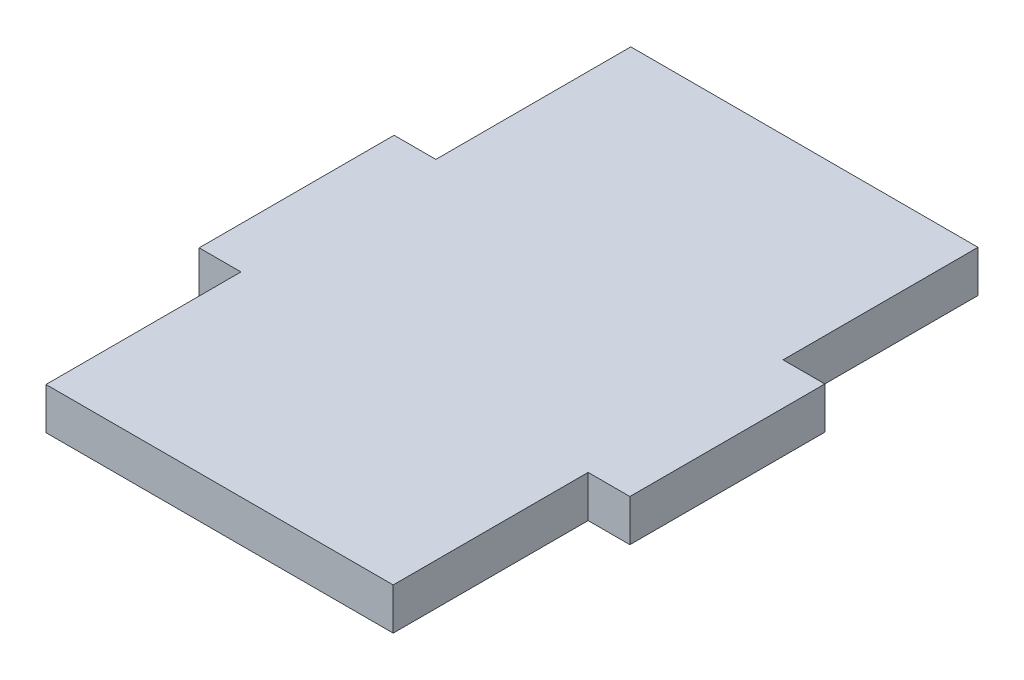
ISO-10303-21;
HEADER;
FILE_DESCRIPTION(('STEP AP214'),'2;1');
FILE_NAME('part.step','',(''),(''),'','','');
FILE_SCHEMA(('AUTOMOTIVE_DESIGN { 1 0 10303 214 1 1 1 1 }'));
ENDSEC;
DATA;
#1=APPLICATION_CONTEXT('core data for automotive mechanical design processes');
#2=APPLICATION_PROTOCOL_DEFINITION('international standard','automotive_design',2000,#1);
#3=PRODUCT_CONTEXT('',#1,'mechanical');
#4=PRODUCT('Part','Part','',(#3));
#5=PRODUCT_RELATED_PRODUCT_CATEGORY('part','',(#4));
#6=PRODUCT_DEFINITION_FORMATION('','',#4);
#7=PRODUCT_DEFINITION_CONTEXT('part definition',#1,'design');
#8=PRODUCT_DEFINITION('design','',#6,#7);
#9=PRODUCT_DEFINITION_SHAPE('','',#8);
#10=(LENGTH_UNIT() NAMED_UNIT(*) SI_UNIT(.MILLI.,.METRE.));
#11=(NAMED_UNIT(*) PLANE_ANGLE_UNIT() SI_UNIT($,.RADIAN.));
#12=(NAMED_UNIT(*) SI_UNIT($,.STERADIAN.) SOLID_ANGLE_UNIT());
#13=UNCERTAINTY_MEASURE_WITH_UNIT(LENGTH_MEASURE(1.E-05),#10,'distance_accuracy_value','');
#14=(GEOMETRIC_REPRESENTATION_CONTEXT(3) GLOBAL_UNCERTAINTY_ASSIGNED_CONTEXT((#13)) GLOBAL_UNIT_ASSIGNED_CONTEXT((#10,
#11,#12)) REPRESENTATION_CONTEXT('',''));
#15=CARTESIAN_POINT('',(0.,0.,0.));
#16=DIRECTION('',(0.,0.,1.));
#17=DIRECTION('',(1.,0.,0.));
#18=AXIS2_PLACEMENT_3D('',#15,#16,#17);
#19=CARTESIAN_POINT('',(29.5656,3.175,0.));
#20=DIRECTION('',(1.,0.,0.));
#21=DIRECTION('',(0.,0.,-1.));
#22=AXIS2_PLACEMENT_3D('',#19,#20,#21);
#23=PLANE('',#22);
#24=DIRECTION('',(0.,0.,1.));
#25=VECTOR('',#24,1.);
#26=CARTESIAN_POINT('',(29.5656,0.,0.));
#27=LINE('',#26,#25);
#28=CARTESIAN_POINT('',(29.5656,0.,0.));
#29=VERTEX_POINT('',#28);
#30=CARTESIAN_POINT('',(29.5656,0.,14.8166666666667));
#31=VERTEX_POINT('',#30);
#32=EDGE_CURVE('E152',#29,#31,#27,.T.);
#33=ORIENTED_EDGE('',*,*,#32,.F.);
#34=DIRECTION('',(0.,-1.,0.));
#35=VECTOR('',#34,1.);
#36=CARTESIAN_POINT('',(29.5656,3.175,0.));
#37=LINE('',#36,#35);
#38=CARTESIAN_POINT('',(29.5656,3.175,0.));
#39=VERTEX_POINT('',#38);
#40=EDGE_CURVE('E11',#39,#29,#37,.T.);
#41=ORIENTED_EDGE('',*,*,#40,.F.);
#42=DIRECTION('',(0.,0.,1.));
#43=VECTOR('',#42,1.);
#44=CARTESIAN_POINT('',(29.5656,3.175,0.));
#45=LINE('',#44,#43);
#46=CARTESIAN_POINT('',(29.5656,3.175,14.8166666666667));
#47=VERTEX_POINT('',#46);
#48=EDGE_CURVE('E176',#39,#47,#45,.T.);
#49=ORIENTED_EDGE('',*,*,#48,.T.);
#50=DIRECTION('',(0.,-1.,0.));
#51=VECTOR('',#50,1.);
#52=CARTESIAN_POINT('',(29.5656,3.175,14.8166666666667));
#53=LINE('',#52,#51);
#54=EDGE_CURVE('E52',#47,#31,#53,.T.);
#55=ORIENTED_EDGE('',*,*,#54,.T.);
#56=EDGE_LOOP('',(#33,#41,#49,#55));
#57=FACE_BOUND('',#56,.T.);
#58=ADVANCED_FACE('F35',(#57),#23,.T.);
#59=CARTESIAN_POINT('',(0.,3.175,0.));
#60=DIRECTION('',(0.,0.,-1.));
#61=DIRECTION('',(-1.,0.,0.));
#62=AXIS2_PLACEMENT_3D('',#59,#60,#61);
#63=PLANE('',#62);
#64=DIRECTION('',(1.,0.,0.));
#65=VECTOR('',#64,1.);
#66=CARTESIAN_POINT('',(0.,0.,0.));
#67=LINE('',#66,#65);
#68=CARTESIAN_POINT('',(3.175,0.,0.));
#69=VERTEX_POINT('',#68);
#70=EDGE_CURVE('E154',#69,#29,#67,.T.);
#71=ORIENTED_EDGE('',*,*,#70,.F.);
#72=DIRECTION('',(0.,-1.,0.));
#73=VECTOR('',#72,1.);
#74=CARTESIAN_POINT('',(3.175,3.175,0.));
#75=LINE('',#74,#73);
#76=CARTESIAN_POINT('',(3.175,3.175,0.));
#77=VERTEX_POINT('',#76);
#78=EDGE_CURVE('E44',#77,#69,#75,.T.);
#79=ORIENTED_EDGE('',*,*,#78,.F.);
#80=DIRECTION('',(1.,0.,0.));
#81=VECTOR('',#80,1.);
#82=CARTESIAN_POINT('',(0.,3.175,0.));
#83=LINE('',#82,#81);
#84=EDGE_CURVE('E210',#77,#39,#83,.T.);
#85=ORIENTED_EDGE('',*,*,#84,.T.);
#86=ORIENTED_EDGE('',*,*,#40,.T.);
#87=EDGE_LOOP('',(#71,#79,#85,#86));
#88=FACE_BOUND('',#87,.T.);
#89=ADVANCED_FACE('F37',(#88),#63,.T.);
#90=CARTESIAN_POINT('',(3.175,3.175,0.));
#91=DIRECTION('',(1.,0.,0.));
#92=DIRECTION('',(0.,0.,-1.));
#93=AXIS2_PLACEMENT_3D('',#90,#91,#92);
#94=PLANE('',#93);
#95=DIRECTION('',(0.,0.,1.));
#96=VECTOR('',#95,1.);
#97=CARTESIAN_POINT('',(3.175,0.,0.));
#98=LINE('',#97,#96);
#99=CARTESIAN_POINT('',(3.175,0.,14.8166666666667));
#100=VERTEX_POINT('',#99);
#101=EDGE_CURVE('E158',#69,#100,#98,.T.);
#102=ORIENTED_EDGE('',*,*,#101,.T.);
#103=DIRECTION('',(0.,-1.,0.));
#104=VECTOR('',#103,1.);
#105=CARTESIAN_POINT('',(3.175,3.175,14.8166666666667));
#106=LINE('',#105,#104);
#107=CARTESIAN_POINT('',(3.175,3.175,14.8166666666667));
#108=VERTEX_POINT('',#107);
#109=EDGE_CURVE('E194',#108,#100,#106,.T.);
#110=ORIENTED_EDGE('',*,*,#109,.F.);
#111=DIRECTION('',(0.,0.,1.));
#112=VECTOR('',#111,1.);
#113=CARTESIAN_POINT('',(3.175,3.175,0.));
#114=LINE('',#113,#112);
#115=EDGE_CURVE('E201',#77,#108,#114,.T.);
#116=ORIENTED_EDGE('',*,*,#115,.F.);
#117=ORIENTED_EDGE('',*,*,#78,.T.);
#118=EDGE_LOOP('',(#102,#110,#116,#117));
#119=FACE_BOUND('',#118,.T.);
#120=ADVANCED_FACE('F199',(#119),#94,.F.);
#121=CARTESIAN_POINT('',(0.,3.175,14.8166666666667));
#122=DIRECTION('',(0.,0.,1.));
#123=DIRECTION('',(1.,0.,0.));
#124=AXIS2_PLACEMENT_3D('',#121,#122,#123);
#125=PLANE('',#124);
#126=DIRECTION('',(-1.,0.,0.));
#127=VECTOR('',#126,1.);
#128=CARTESIAN_POINT('',(0.,0.,14.8166666666667));
#129=LINE('',#128,#127);
#130=CARTESIAN_POINT('',(0.,0.,14.8166666666667));
#131=VERTEX_POINT('',#130);
#132=EDGE_CURVE('E160',#100,#131,#129,.T.);
#133=ORIENTED_EDGE('',*,*,#132,.T.);
#134=DIRECTION('',(0.,-1.,0.));
#135=VECTOR('',#134,1.);
#136=CARTESIAN_POINT('',(0.,3.175,14.8166666666667));
#137=LINE('',#136,#135);
#138=CARTESIAN_POINT('',(0.,3.175,14.8166666666667));
#139=VERTEX_POINT('',#138);
#140=EDGE_CURVE('E191',#139,#131,#137,.T.);
#141=ORIENTED_EDGE('',*,*,#140,.F.);
#142=DIRECTION('',(-1.,0.,0.));
#143=VECTOR('',#142,1.);
#144=CARTESIAN_POINT('',(0.,3.175,14.8166666666667));
#145=LINE('',#144,#143);
#146=EDGE_CURVE('E264',#108,#139,#145,.T.);
#147=ORIENTED_EDGE('',*,*,#146,.F.);
#148=ORIENTED_EDGE('',*,*,#109,.T.);
#149=EDGE_LOOP('',(#133,#141,#147,#148));
#150=FACE_BOUND('',#149,.T.);
#151=ADVANCED_FACE('F263',(#150),#125,.F.);
#152=CARTESIAN_POINT('',(0.,3.175,0.));
#153=DIRECTION('',(1.,0.,0.));
#154=DIRECTION('',(0.,0.,-1.));
#155=AXIS2_PLACEMENT_3D('',#152,#153,#154);
#156=PLANE('',#155);
#157=DIRECTION('',(0.,0.,1.));
#158=VECTOR('',#157,1.);
#159=CARTESIAN_POINT('',(0.,0.,0.));
#160=LINE('',#159,#158);
#161=CARTESIAN_POINT('',(0.,0.,29.6333333333333));
#162=VERTEX_POINT('',#161);
#163=EDGE_CURVE('E163',#131,#162,#160,.T.);
#164=ORIENTED_EDGE('',*,*,#163,.T.);
#165=DIRECTION('',(0.,-1.,0.));
#166=VECTOR('',#165,1.);
#167=CARTESIAN_POINT('',(0.,3.175,29.6333333333333));
#168=LINE('',#167,#166);
#169=CARTESIAN_POINT('',(0.,3.175,29.6333333333333));
#170=VERTEX_POINT('',#169);
#171=EDGE_CURVE('E188',#170,#162,#168,.T.);
#172=ORIENTED_EDGE('',*,*,#171,.F.);
#173=DIRECTION('',(0.,0.,1.));
#174=VECTOR('',#173,1.);
#175=CARTESIAN_POINT('',(0.,3.175,0.));
#176=LINE('',#175,#174);
#177=EDGE_CURVE('E260',#139,#170,#176,.T.);
#178=ORIENTED_EDGE('',*,*,#177,.F.);
#179=ORIENTED_EDGE('',*,*,#140,.T.);
#180=EDGE_LOOP('',(#164,#172,#178,#179));
#181=FACE_BOUND('',#180,.T.);
#182=ADVANCED_FACE('F257',(#181),#156,.F.);
#183=CARTESIAN_POINT('',(0.,3.175,29.6333333333333));
#184=DIRECTION('',(0.,0.,-1.));
#185=DIRECTION('',(-1.,0.,0.));
#186=AXIS2_PLACEMENT_3D('',#183,#184,#185);
#187=PLANE('',#186);
#188=DIRECTION('',(1.,0.,0.));
#189=VECTOR('',#188,1.);
#190=CARTESIAN_POINT('',(0.,0.,29.6333333333333));
#191=LINE('',#190,#189);
#192=CARTESIAN_POINT('',(3.175,0.,29.6333333333333));
#193=VERTEX_POINT('',#192);
#194=EDGE_CURVE('E165',#162,#193,#191,.T.);
#195=ORIENTED_EDGE('',*,*,#194,.T.);
#196=DIRECTION('',(0.,-1.,0.));
#197=VECTOR('',#196,1.);
#198=CARTESIAN_POINT('',(3.175,3.175,29.6333333333333));
#199=LINE('',#198,#197);
#200=CARTESIAN_POINT('',(3.175,3.175,29.6333333333333));
#201=VERTEX_POINT('',#200);
#202=EDGE_CURVE('E185',#201,#193,#199,.T.);
#203=ORIENTED_EDGE('',*,*,#202,.F.);
#204=DIRECTION('',(1.,0.,0.));
#205=VECTOR('',#204,1.);
#206=CARTESIAN_POINT('',(0.,3.175,29.6333333333333));
#207=LINE('',#206,#205);
#208=EDGE_CURVE('E254',#170,#201,#207,.T.);
#209=ORIENTED_EDGE('',*,*,#208,.F.);
#210=ORIENTED_EDGE('',*,*,#171,.T.);
#211=EDGE_LOOP('',(#195,#203,#209,#210));
#212=FACE_BOUND('',#211,.T.);
#213=ADVANCED_FACE('F253',(#212),#187,.F.);
#214=CARTESIAN_POINT('',(3.17500000000001,0.,44.45));
#215=VERTEX_POINT('',#214);
#216=EDGE_CURVE('E161',#193,#215,#98,.T.);
#217=ORIENTED_EDGE('',*,*,#216,.T.);
#218=DIRECTION('',(0.,-1.,0.));
#219=VECTOR('',#218,1.);
#220=CARTESIAN_POINT('',(3.17500000000001,3.175,44.45));
#221=LINE('',#220,#219);
#222=CARTESIAN_POINT('',(3.17500000000001,3.175,44.45));
#223=VERTEX_POINT('',#222);
#224=EDGE_CURVE('E182',#223,#215,#221,.T.);
#225=ORIENTED_EDGE('',*,*,#224,.F.);
#226=EDGE_CURVE('E249',#201,#223,#114,.T.);
#227=ORIENTED_EDGE('',*,*,#226,.F.);
#228=ORIENTED_EDGE('',*,*,#202,.T.);
#229=EDGE_LOOP('',(#217,#225,#227,#228));
#230=FACE_BOUND('',#229,.T.);
#231=ADVANCED_FACE('F236',(#230),#94,.F.);
#232=CARTESIAN_POINT('',(0.,3.175,44.45));
#233=DIRECTION('',(0.,0.,-1.));
#234=DIRECTION('',(-1.,0.,0.));
#235=AXIS2_PLACEMENT_3D('',#232,#233,#234);
#236=PLANE('',#235);
#237=DIRECTION('',(1.,0.,0.));
#238=VECTOR('',#237,1.);
#239=CARTESIAN_POINT('',(0.,0.,44.45));
#240=LINE('',#239,#238);
#241=CARTESIAN_POINT('',(29.5656,0.,44.45));
#242=VERTEX_POINT('',#241);
#243=EDGE_CURVE('E167',#215,#242,#240,.T.);
#244=ORIENTED_EDGE('',*,*,#243,.T.);
#245=DIRECTION('',(0.,-1.,0.));
#246=VECTOR('',#245,1.);
#247=CARTESIAN_POINT('',(29.5656,3.175,44.45));
#248=LINE('',#247,#246);
#249=CARTESIAN_POINT('',(29.5656,3.175,44.45));
#250=VERTEX_POINT('',#249);
#251=EDGE_CURVE('E180',#250,#242,#248,.T.);
#252=ORIENTED_EDGE('',*,*,#251,.F.);
#253=DIRECTION('',(1.,0.,0.));
#254=VECTOR('',#253,1.);
#255=CARTESIAN_POINT('',(0.,3.175,44.45));
#256=LINE('',#255,#254);
#257=EDGE_CURVE('E246',#223,#250,#256,.T.);
#258=ORIENTED_EDGE('',*,*,#257,.F.);
#259=ORIENTED_EDGE('',*,*,#224,.T.);
#260=EDGE_LOOP('',(#244,#252,#258,#259));
#261=FACE_BOUND('',#260,.T.);
#262=ADVANCED_FACE('F230',(#261),#236,.F.);
#263=CARTESIAN_POINT('',(29.5656,0.,29.6333333333333));
#264=VERTEX_POINT('',#263);
#265=EDGE_CURVE('E155',#264,#242,#27,.T.);
#266=ORIENTED_EDGE('',*,*,#265,.F.);
#267=DIRECTION('',(0.,-1.,0.));
#268=VECTOR('',#267,1.);
#269=CARTESIAN_POINT('',(29.5656,3.175,29.6333333333333));
#270=LINE('',#269,#268);
#271=CARTESIAN_POINT('',(29.5656,3.175,29.6333333333333));
#272=VERTEX_POINT('',#271);
#273=EDGE_CURVE('E144',#272,#264,#270,.T.);
#274=ORIENTED_EDGE('',*,*,#273,.F.);
#275=EDGE_CURVE('E134',#272,#250,#45,.T.);
#276=ORIENTED_EDGE('',*,*,#275,.T.);
#277=ORIENTED_EDGE('',*,*,#251,.T.);
#278=EDGE_LOOP('',(#266,#274,#276,#277));
#279=FACE_BOUND('',#278,.T.);
#280=ADVANCED_FACE('F223',(#279),#23,.T.);
#281=CARTESIAN_POINT('',(0.,3.175,29.6333333333333));
#282=DIRECTION('',(0.,0.,-1.));
#283=DIRECTION('',(-1.,0.,0.));
#284=AXIS2_PLACEMENT_3D('',#281,#282,#283);
#285=PLANE('',#284);
#286=DIRECTION('',(1.,0.,0.));
#287=VECTOR('',#286,1.);
#288=CARTESIAN_POINT('',(0.,0.,29.6333333333333));
#289=LINE('',#288,#287);
#290=CARTESIAN_POINT('',(32.7406,0.,29.6333333333333));
#291=VERTEX_POINT('',#290);
#292=EDGE_CURVE('E141',#264,#291,#289,.T.);
#293=ORIENTED_EDGE('',*,*,#292,.T.);
#294=DIRECTION('',(0.,-1.,0.));
#295=VECTOR('',#294,1.);
#296=CARTESIAN_POINT('',(32.7406,3.175,29.6333333333333));
#297=LINE('',#296,#295);
#298=CARTESIAN_POINT('',(32.7406,3.175,29.6333333333333));
#299=VERTEX_POINT('',#298);
#300=EDGE_CURVE('E138',#299,#291,#297,.T.);
#301=ORIENTED_EDGE('',*,*,#300,.F.);
#302=DIRECTION('',(1.,0.,0.));
#303=VECTOR('',#302,1.);
#304=CARTESIAN_POINT('',(0.,3.175,29.6333333333333));
#305=LINE('',#304,#303);
#306=EDGE_CURVE('E127',#272,#299,#305,.T.);
#307=ORIENTED_EDGE('',*,*,#306,.F.);
#308=ORIENTED_EDGE('',*,*,#273,.T.);
#309=EDGE_LOOP('',(#293,#301,#307,#308));
#310=FACE_BOUND('',#309,.T.);
#311=ADVANCED_FACE('F139',(#310),#285,.F.);
#312=CARTESIAN_POINT('',(32.7406,3.175,0.));
#313=DIRECTION('',(1.,0.,0.));
#314=DIRECTION('',(0.,0.,-1.));
#315=AXIS2_PLACEMENT_3D('',#312,#313,#314);
#316=PLANE('',#315);
#317=DIRECTION('',(0.,0.,1.));
#318=VECTOR('',#317,1.);
#319=CARTESIAN_POINT('',(32.7406,0.,0.));
#320=LINE('',#319,#318);
#321=CARTESIAN_POINT('',(32.7406,0.,14.8166666666667));
#322=VERTEX_POINT('',#321);
#323=EDGE_CURVE('E171',#322,#291,#320,.T.);
#324=ORIENTED_EDGE('',*,*,#323,.F.);
#325=DIRECTION('',(0.,-1.,0.));
#326=VECTOR('',#325,1.);
#327=CARTESIAN_POINT('',(32.7406,3.175,14.8166666666667));
#328=LINE('',#327,#326);
#329=CARTESIAN_POINT('',(32.7406,3.175,14.8166666666667));
#330=VERTEX_POINT('',#329);
#331=EDGE_CURVE('E89',#330,#322,#328,.T.);
#332=ORIENTED_EDGE('',*,*,#331,.F.);
#333=DIRECTION('',(0.,0.,1.));
#334=VECTOR('',#333,1.);
#335=CARTESIAN_POINT('',(32.7406,3.175,0.));
#336=LINE('',#335,#334);
#337=EDGE_CURVE('E132',#330,#299,#336,.T.);
#338=ORIENTED_EDGE('',*,*,#337,.T.);
#339=ORIENTED_EDGE('',*,*,#300,.T.);
#340=EDGE_LOOP('',(#324,#332,#338,#339));
#341=FACE_BOUND('',#340,.T.);
#342=ADVANCED_FACE('F146',(#341),#316,.T.);
#343=CARTESIAN_POINT('',(0.,3.175,14.8166666666667));
#344=DIRECTION('',(0.,0.,-1.));
#345=DIRECTION('',(-1.,0.,0.));
#346=AXIS2_PLACEMENT_3D('',#343,#344,#345);
#347=PLANE('',#346);
#348=DIRECTION('',(1.,0.,0.));
#349=VECTOR('',#348,1.);
#350=CARTESIAN_POINT('',(0.,0.,14.8166666666667));
#351=LINE('',#350,#349);
#352=EDGE_CURVE('E173',#31,#322,#351,.T.);
#353=ORIENTED_EDGE('',*,*,#352,.F.);
#354=ORIENTED_EDGE('',*,*,#54,.F.);
#355=DIRECTION('',(1.,0.,0.));
#356=VECTOR('',#355,1.);
#357=CARTESIAN_POINT('',(0.,3.175,14.8166666666667));
#358=LINE('',#357,#356);
#359=EDGE_CURVE('E147',#47,#330,#358,.T.);
#360=ORIENTED_EDGE('',*,*,#359,.T.);
#361=ORIENTED_EDGE('',*,*,#331,.T.);
#362=EDGE_LOOP('',(#353,#354,#360,#361));
#363=FACE_BOUND('',#362,.T.);
#364=ADVANCED_FACE('F211',(#363),#347,.T.);
#365=CARTESIAN_POINT('',(0.,3.175,0.));
#366=DIRECTION('',(0.,1.,0.));
#367=DIRECTION('',(0.,0.,1.));
#368=AXIS2_PLACEMENT_3D('',#365,#366,#367);
#369=PLANE('',#368);
#370=ORIENTED_EDGE('',*,*,#48,.F.);
#371=ORIENTED_EDGE('',*,*,#84,.F.);
#372=ORIENTED_EDGE('',*,*,#115,.T.);
#373=ORIENTED_EDGE('',*,*,#146,.T.);
#374=ORIENTED_EDGE('',*,*,#177,.T.);
#375=ORIENTED_EDGE('',*,*,#208,.T.);
#376=ORIENTED_EDGE('',*,*,#226,.T.);
#377=ORIENTED_EDGE('',*,*,#257,.T.);
#378=ORIENTED_EDGE('',*,*,#275,.F.);
#379=ORIENTED_EDGE('',*,*,#306,.T.);
#380=ORIENTED_EDGE('',*,*,#337,.F.);
#381=ORIENTED_EDGE('',*,*,#359,.F.);
#382=EDGE_LOOP('',(#370,#371,#372,#373,#374,#375,#376,#377,#378,#379,#380,#381));
#383=FACE_BOUND('',#382,.T.);
#384=ADVANCED_FACE('F129',(#383),#369,.T.);
#385=CARTESIAN_POINT('',(0.,0.,0.));
#386=DIRECTION('',(0.,1.,0.));
#387=DIRECTION('',(0.,0.,1.));
#388=AXIS2_PLACEMENT_3D('',#385,#386,#387);
#389=PLANE('',#388);
#390=ORIENTED_EDGE('',*,*,#32,.T.);
#391=ORIENTED_EDGE('',*,*,#352,.T.);
#392=ORIENTED_EDGE('',*,*,#323,.T.);
#393=ORIENTED_EDGE('',*,*,#292,.F.);
#394=ORIENTED_EDGE('',*,*,#265,.T.);
#395=ORIENTED_EDGE('',*,*,#243,.F.);
#396=ORIENTED_EDGE('',*,*,#216,.F.);
#397=ORIENTED_EDGE('',*,*,#194,.F.);
#398=ORIENTED_EDGE('',*,*,#163,.F.);
#399=ORIENTED_EDGE('',*,*,#132,.F.);
#400=ORIENTED_EDGE('',*,*,#101,.F.);
#401=ORIENTED_EDGE('',*,*,#70,.T.);
#402=EDGE_LOOP('',(#390,#391,#392,#393,#394,#395,#396,#397,#398,#399,#400,#401));
#403=FACE_BOUND('',#402,.T.);
#404=ADVANCED_FACE('F208',(#403),#389,.F.);
#405=CLOSED_SHELL('',(#58,#89,#120,#151,#182,#213,#231,#262,#280,#311,#342,#364,#384,#404));
#406=MANIFOLD_SOLID_BREP('B2',#405);
#407=ADVANCED_BREP_SHAPE_REPRESENTATION('',(#18,#406),#14);
#408=SHAPE_DEFINITION_REPRESENTATION(#9,#407);
ENDSEC;
END-ISO-10303-21;
